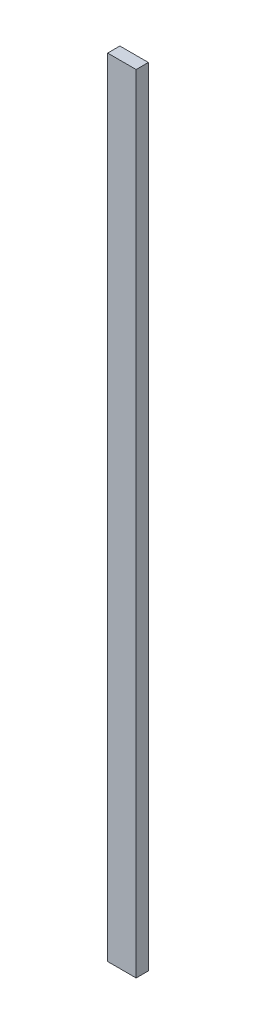
ISO-10303-21;
HEADER;
FILE_DESCRIPTION(('STEP AP214'),'2;1');
FILE_NAME('part.step','',(''),(''),'','','');
FILE_SCHEMA(('AUTOMOTIVE_DESIGN { 1 0 10303 214 1 1 1 1 }'));
ENDSEC;
DATA;
#1=APPLICATION_CONTEXT('core data for automotive mechanical design processes');
#2=APPLICATION_PROTOCOL_DEFINITION('international standard','automotive_design',2000,#1);
#3=PRODUCT_CONTEXT('',#1,'mechanical');
#4=PRODUCT('Part','Part','',(#3));
#5=PRODUCT_RELATED_PRODUCT_CATEGORY('part','',(#4));
#6=PRODUCT_DEFINITION_FORMATION('','',#4);
#7=PRODUCT_DEFINITION_CONTEXT('part definition',#1,'design');
#8=PRODUCT_DEFINITION('design','',#6,#7);
#9=PRODUCT_DEFINITION_SHAPE('','',#8);
#10=(LENGTH_UNIT() NAMED_UNIT(*) SI_UNIT(.MILLI.,.METRE.));
#11=(NAMED_UNIT(*) PLANE_ANGLE_UNIT() SI_UNIT($,.RADIAN.));
#12=(NAMED_UNIT(*) SI_UNIT($,.STERADIAN.) SOLID_ANGLE_UNIT());
#13=UNCERTAINTY_MEASURE_WITH_UNIT(LENGTH_MEASURE(1.E-05),#10,'distance_accuracy_value','');
#14=(GEOMETRIC_REPRESENTATION_CONTEXT(3) GLOBAL_UNCERTAINTY_ASSIGNED_CONTEXT((#13)) GLOBAL_UNIT_ASSIGNED_CONTEXT((#10,
#11,#12)) REPRESENTATION_CONTEXT('',''));
#15=CARTESIAN_POINT('',(0.,0.,0.));
#16=DIRECTION('',(0.,0.,1.));
#17=DIRECTION('',(1.,0.,0.));
#18=AXIS2_PLACEMENT_3D('',#15,#16,#17);
#19=CARTESIAN_POINT('',(-44.45,2454.148,19.05));
#20=DIRECTION('',(1.,0.,0.));
#21=DIRECTION('',(0.,0.,-1.));
#22=AXIS2_PLACEMENT_3D('',#19,#20,#21);
#23=PLANE('',#22);
#24=DIRECTION('',(0.,0.,1.));
#25=VECTOR('',#24,1.);
#26=CARTESIAN_POINT('',(-44.45,0.,19.05));
#27=LINE('',#26,#25);
#28=CARTESIAN_POINT('',(-44.45,0.,-19.05));
#29=VERTEX_POINT('',#28);
#30=CARTESIAN_POINT('',(-44.45,0.,19.05));
#31=VERTEX_POINT('',#30);
#32=EDGE_CURVE('E107',#29,#31,#27,.T.);
#33=ORIENTED_EDGE('',*,*,#32,.T.);
#34=DIRECTION('',(0.,-1.,0.));
#35=VECTOR('',#34,1.);
#36=CARTESIAN_POINT('',(-44.45,2454.148,19.05));
#37=LINE('',#36,#35);
#38=CARTESIAN_POINT('',(-44.45,2454.148,19.05));
#39=VERTEX_POINT('',#38);
#40=EDGE_CURVE('E11',#39,#31,#37,.T.);
#41=ORIENTED_EDGE('',*,*,#40,.F.);
#42=DIRECTION('',(0.,0.,1.));
#43=VECTOR('',#42,1.);
#44=CARTESIAN_POINT('',(-44.45,2454.148,19.05));
#45=LINE('',#44,#43);
#46=CARTESIAN_POINT('',(-44.45,2454.148,-19.05));
#47=VERTEX_POINT('',#46);
#48=EDGE_CURVE('E91',#47,#39,#45,.T.);
#49=ORIENTED_EDGE('',*,*,#48,.F.);
#50=DIRECTION('',(0.,-1.,0.));
#51=VECTOR('',#50,1.);
#52=CARTESIAN_POINT('',(-44.45,2454.148,-19.05));
#53=LINE('',#52,#51);
#54=EDGE_CURVE('E103',#47,#29,#53,.T.);
#55=ORIENTED_EDGE('',*,*,#54,.T.);
#56=EDGE_LOOP('',(#33,#41,#49,#55));
#57=FACE_BOUND('',#56,.T.);
#58=ADVANCED_FACE('F39',(#57),#23,.F.);
#59=CARTESIAN_POINT('',(44.45,2454.148,19.05));
#60=DIRECTION('',(0.,0.,-1.));
#61=DIRECTION('',(-1.,0.,0.));
#62=AXIS2_PLACEMENT_3D('',#59,#60,#61);
#63=PLANE('',#62);
#64=DIRECTION('',(1.,0.,0.));
#65=VECTOR('',#64,1.);
#66=CARTESIAN_POINT('',(44.45,0.,19.05));
#67=LINE('',#66,#65);
#68=CARTESIAN_POINT('',(44.45,0.,19.05));
#69=VERTEX_POINT('',#68);
#70=EDGE_CURVE('E96',#31,#69,#67,.T.);
#71=ORIENTED_EDGE('',*,*,#70,.T.);
#72=DIRECTION('',(0.,-1.,0.));
#73=VECTOR('',#72,1.);
#74=CARTESIAN_POINT('',(44.45,2454.148,19.05));
#75=LINE('',#74,#73);
#76=CARTESIAN_POINT('',(44.45,2454.148,19.05));
#77=VERTEX_POINT('',#76);
#78=EDGE_CURVE('E48',#77,#69,#75,.T.);
#79=ORIENTED_EDGE('',*,*,#78,.F.);
#80=DIRECTION('',(1.,0.,0.));
#81=VECTOR('',#80,1.);
#82=CARTESIAN_POINT('',(44.45,2454.148,19.05));
#83=LINE('',#82,#81);
#84=EDGE_CURVE('E86',#39,#77,#83,.T.);
#85=ORIENTED_EDGE('',*,*,#84,.F.);
#86=ORIENTED_EDGE('',*,*,#40,.T.);
#87=EDGE_LOOP('',(#71,#79,#85,#86));
#88=FACE_BOUND('',#87,.T.);
#89=ADVANCED_FACE('F95',(#88),#63,.F.);
#90=CARTESIAN_POINT('',(44.45,2454.148,19.05));
#91=DIRECTION('',(-1.,0.,0.));
#92=DIRECTION('',(0.,0.,1.));
#93=AXIS2_PLACEMENT_3D('',#90,#91,#92);
#94=PLANE('',#93);
#95=DIRECTION('',(0.,0.,-1.));
#96=VECTOR('',#95,1.);
#97=CARTESIAN_POINT('',(44.45,0.,19.05));
#98=LINE('',#97,#96);
#99=CARTESIAN_POINT('',(44.45,0.,-19.05));
#100=VERTEX_POINT('',#99);
#101=EDGE_CURVE('E73',#69,#100,#98,.T.);
#102=ORIENTED_EDGE('',*,*,#101,.T.);
#103=DIRECTION('',(0.,-1.,0.));
#104=VECTOR('',#103,1.);
#105=CARTESIAN_POINT('',(44.45,2454.148,-19.05));
#106=LINE('',#105,#104);
#107=CARTESIAN_POINT('',(44.45,2454.148,-19.05));
#108=VERTEX_POINT('',#107);
#109=EDGE_CURVE('E98',#108,#100,#106,.T.);
#110=ORIENTED_EDGE('',*,*,#109,.F.);
#111=DIRECTION('',(0.,0.,-1.));
#112=VECTOR('',#111,1.);
#113=CARTESIAN_POINT('',(44.45,2454.148,19.05));
#114=LINE('',#113,#112);
#115=EDGE_CURVE('E89',#77,#108,#114,.T.);
#116=ORIENTED_EDGE('',*,*,#115,.F.);
#117=ORIENTED_EDGE('',*,*,#78,.T.);
#118=EDGE_LOOP('',(#102,#110,#116,#117));
#119=FACE_BOUND('',#118,.T.);
#120=ADVANCED_FACE('F99',(#119),#94,.F.);
#121=CARTESIAN_POINT('',(44.45,2454.148,-19.05));
#122=DIRECTION('',(0.,0.,1.));
#123=DIRECTION('',(1.,0.,0.));
#124=AXIS2_PLACEMENT_3D('',#121,#122,#123);
#125=PLANE('',#124);
#126=DIRECTION('',(-1.,0.,0.));
#127=VECTOR('',#126,1.);
#128=CARTESIAN_POINT('',(44.45,0.,-19.05));
#129=LINE('',#128,#127);
#130=EDGE_CURVE('E79',#100,#29,#129,.T.);
#131=ORIENTED_EDGE('',*,*,#130,.T.);
#132=ORIENTED_EDGE('',*,*,#54,.F.);
#133=DIRECTION('',(-1.,0.,0.));
#134=VECTOR('',#133,1.);
#135=CARTESIAN_POINT('',(44.45,2454.148,-19.05));
#136=LINE('',#135,#134);
#137=EDGE_CURVE('E56',#108,#47,#136,.T.);
#138=ORIENTED_EDGE('',*,*,#137,.F.);
#139=ORIENTED_EDGE('',*,*,#109,.T.);
#140=EDGE_LOOP('',(#131,#132,#138,#139));
#141=FACE_BOUND('',#140,.T.);
#142=ADVANCED_FACE('F120',(#141),#125,.F.);
#143=CARTESIAN_POINT('',(0.,2454.148,0.));
#144=DIRECTION('',(0.,1.,0.));
#145=DIRECTION('',(0.,0.,1.));
#146=AXIS2_PLACEMENT_3D('',#143,#144,#145);
#147=PLANE('',#146);
#148=ORIENTED_EDGE('',*,*,#48,.T.);
#149=ORIENTED_EDGE('',*,*,#84,.T.);
#150=ORIENTED_EDGE('',*,*,#115,.T.);
#151=ORIENTED_EDGE('',*,*,#137,.T.);
#152=EDGE_LOOP('',(#148,#149,#150,#151));
#153=FACE_BOUND('',#152,.T.);
#154=ADVANCED_FACE('F87',(#153),#147,.T.);
#155=CARTESIAN_POINT('',(0.,0.,0.));
#156=DIRECTION('',(0.,1.,0.));
#157=DIRECTION('',(0.,0.,1.));
#158=AXIS2_PLACEMENT_3D('',#155,#156,#157);
#159=PLANE('',#158);
#160=ORIENTED_EDGE('',*,*,#32,.F.);
#161=ORIENTED_EDGE('',*,*,#130,.F.);
#162=ORIENTED_EDGE('',*,*,#101,.F.);
#163=ORIENTED_EDGE('',*,*,#70,.F.);
#164=EDGE_LOOP('',(#160,#161,#162,#163));
#165=FACE_BOUND('',#164,.T.);
#166=ADVANCED_FACE('F123',(#165),#159,.F.);
#167=CLOSED_SHELL('',(#58,#89,#120,#142,#154,#166));
#168=MANIFOLD_SOLID_BREP('B2',#167);
#169=ADVANCED_BREP_SHAPE_REPRESENTATION('',(#18,#168),#14);
#170=SHAPE_DEFINITION_REPRESENTATION(#9,#169);
ENDSEC;
END-ISO-10303-21;
